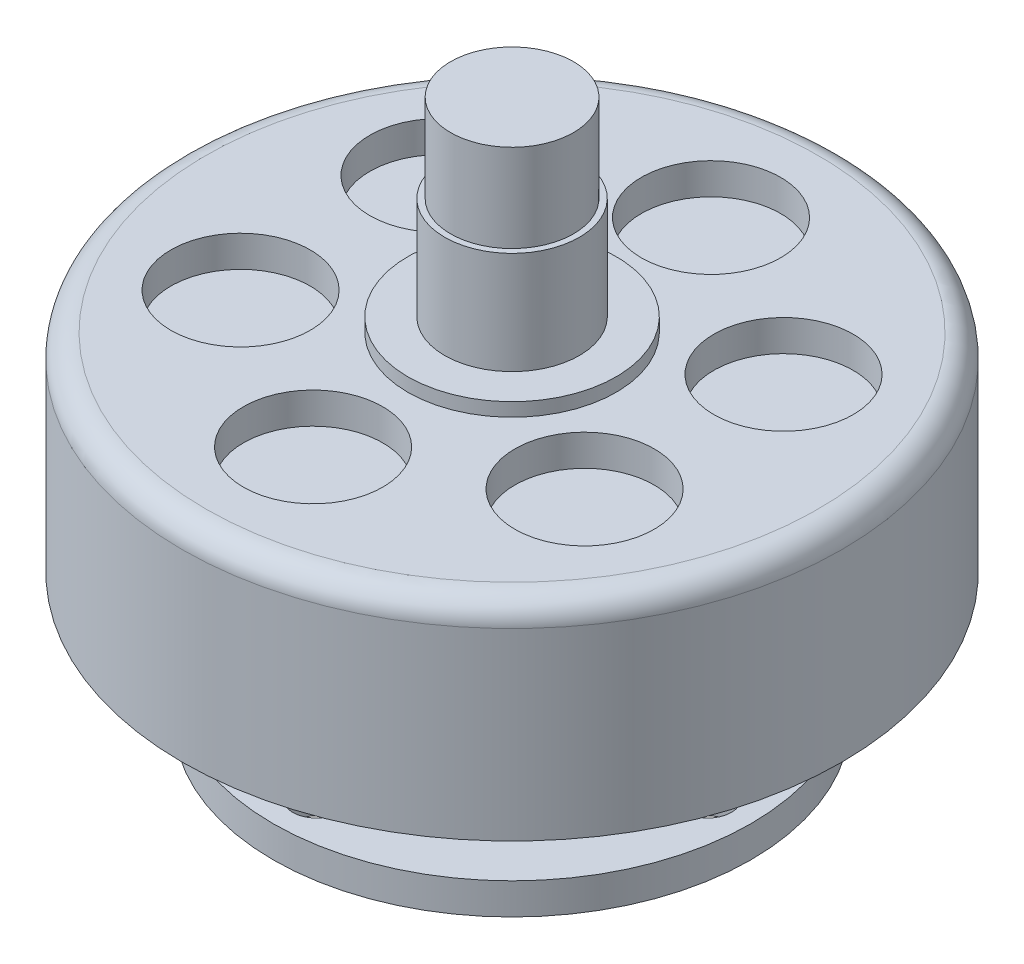
ISO-10303-21;
HEADER;
FILE_DESCRIPTION(('STEP AP214'),'2;1');
FILE_NAME('part.step','',(''),(''),'','','');
FILE_SCHEMA(('AUTOMOTIVE_DESIGN { 1 0 10303 214 1 1 1 1 }'));
ENDSEC;
DATA;
#1=APPLICATION_CONTEXT('core data for automotive mechanical design processes');
#2=APPLICATION_PROTOCOL_DEFINITION('international standard','automotive_design',2000,#1);
#3=PRODUCT_CONTEXT('',#1,'mechanical');
#4=PRODUCT('Part','Part','',(#3));
#5=PRODUCT_RELATED_PRODUCT_CATEGORY('part','',(#4));
#6=PRODUCT_DEFINITION_FORMATION('','',#4);
#7=PRODUCT_DEFINITION_CONTEXT('part definition',#1,'design');
#8=PRODUCT_DEFINITION('design','',#6,#7);
#9=PRODUCT_DEFINITION_SHAPE('','',#8);
#10=(LENGTH_UNIT() NAMED_UNIT(*) SI_UNIT(.MILLI.,.METRE.));
#11=(NAMED_UNIT(*) PLANE_ANGLE_UNIT() SI_UNIT($,.RADIAN.));
#12=(NAMED_UNIT(*) SI_UNIT($,.STERADIAN.) SOLID_ANGLE_UNIT());
#13=UNCERTAINTY_MEASURE_WITH_UNIT(LENGTH_MEASURE(1.E-05),#10,'distance_accuracy_value','');
#14=(GEOMETRIC_REPRESENTATION_CONTEXT(3) GLOBAL_UNCERTAINTY_ASSIGNED_CONTEXT((#13)) GLOBAL_UNIT_ASSIGNED_CONTEXT((#10,
#11,#12)) REPRESENTATION_CONTEXT('',''));
#15=CARTESIAN_POINT('',(0.,0.,0.));
#16=DIRECTION('',(0.,0.,1.));
#17=DIRECTION('',(1.,0.,0.));
#18=AXIS2_PLACEMENT_3D('',#15,#16,#17);
#19=CARTESIAN_POINT('',(0.,-9.5,0.));
#20=DIRECTION('',(0.,-1.,0.));
#21=DIRECTION('',(0.,0.,-1.));
#22=AXIS2_PLACEMENT_3D('',#19,#20,#21);
#23=PLANE('',#22);
#24=CARTESIAN_POINT('',(0.,-9.5,0.));
#25=DIRECTION('',(0.,-1.,0.));
#26=DIRECTION('',(0.,0.,-1.));
#27=AXIS2_PLACEMENT_3D('',#24,#25,#26);
#28=CIRCLE('',#27,3.);
#29=CARTESIAN_POINT('',(-1.75,-9.5,2.43669858620224));
#30=VERTEX_POINT('',#29);
#31=CARTESIAN_POINT('',(1.75,-9.5,2.43669858620224));
#32=VERTEX_POINT('',#31);
#33=EDGE_CURVE('E57',#30,#32,#28,.T.);
#34=ORIENTED_EDGE('',*,*,#33,.T.);
#35=DIRECTION('',(0.,0.,1.));
#36=VECTOR('',#35,1.);
#37=CARTESIAN_POINT('',(1.75,-9.5,3.45));
#38=LINE('',#37,#36);
#39=CARTESIAN_POINT('',(1.75,-9.5,0.968245836551854));
#40=VERTEX_POINT('',#39);
#41=EDGE_CURVE('E115',#40,#32,#38,.T.);
#42=ORIENTED_EDGE('',*,*,#41,.F.);
#43=CARTESIAN_POINT('',(0.,-9.5,0.));
#44=DIRECTION('',(0.,-1.,0.));
#45=DIRECTION('',(0.,0.,-1.));
#46=AXIS2_PLACEMENT_3D('',#43,#44,#45);
#47=CIRCLE('',#46,2.);
#48=CARTESIAN_POINT('',(-1.75,-9.5,0.968245836551854));
#49=VERTEX_POINT('',#48);
#50=EDGE_CURVE('E125',#49,#40,#47,.T.);
#51=ORIENTED_EDGE('',*,*,#50,.F.);
#52=DIRECTION('',(0.,0.,-1.));
#53=VECTOR('',#52,1.);
#54=CARTESIAN_POINT('',(-1.75,-9.5,0.0104918949249585));
#55=LINE('',#54,#53);
#56=EDGE_CURVE('E53',#30,#49,#55,.T.);
#57=ORIENTED_EDGE('',*,*,#56,.F.);
#58=EDGE_LOOP('',(#34,#42,#51,#57));
#59=FACE_BOUND('',#58,.T.);
#60=ADVANCED_FACE('F36',(#59),#23,.T.);
#61=CARTESIAN_POINT('',(0.,-11.,0.));
#62=DIRECTION('',(0.,1.,0.));
#63=DIRECTION('',(0.,0.,1.));
#64=AXIS2_PLACEMENT_3D('',#61,#62,#63);
#65=CYLINDRICAL_SURFACE('',#64,2.);
#66=CARTESIAN_POINT('',(0.,-11.,0.));
#67=DIRECTION('',(0.,-1.,0.));
#68=DIRECTION('',(0.,0.,-1.));
#69=AXIS2_PLACEMENT_3D('',#66,#67,#68);
#70=CIRCLE('',#69,2.);
#71=CARTESIAN_POINT('',(0.,-11.,-2.));
#72=VERTEX_POINT('',#71);
#73=EDGE_CURVE('E128',#72,#72,#70,.T.);
#74=ORIENTED_EDGE('',*,*,#73,.F.);
#75=EDGE_LOOP('',(#74));
#76=FACE_BOUND('',#75,.T.);
#77=DIRECTION('',(0.,1.,0.));
#78=VECTOR('',#77,1.);
#79=CARTESIAN_POINT('',(1.75,-11.,0.968245836551854));
#80=LINE('',#79,#78);
#81=CARTESIAN_POINT('',(1.75,-9.7,0.968245836551854));
#82=VERTEX_POINT('',#81);
#83=EDGE_CURVE('E11',#82,#40,#80,.T.);
#84=ORIENTED_EDGE('',*,*,#83,.F.);
#85=CARTESIAN_POINT('',(0.,-9.7,0.));
#86=DIRECTION('',(0.,1.,0.));
#87=DIRECTION('',(0.,0.,1.));
#88=AXIS2_PLACEMENT_3D('',#85,#86,#87);
#89=CIRCLE('',#88,2.);
#90=CARTESIAN_POINT('',(-1.75,-9.7,0.968245836551854));
#91=VERTEX_POINT('',#90);
#92=EDGE_CURVE('E91',#91,#82,#89,.T.);
#93=ORIENTED_EDGE('',*,*,#92,.F.);
#94=DIRECTION('',(0.,1.,0.));
#95=VECTOR('',#94,1.);
#96=CARTESIAN_POINT('',(-1.75,-11.,0.968245836551854));
#97=LINE('',#96,#95);
#98=EDGE_CURVE('E45',#49,#91,#97,.F.);
#99=ORIENTED_EDGE('',*,*,#98,.F.);
#100=ORIENTED_EDGE('',*,*,#50,.T.);
#101=EDGE_LOOP('',(#84,#93,#99,#100));
#102=FACE_BOUND('',#101,.T.);
#103=ADVANCED_FACE('F278',(#76,#102),#65,.T.);
#104=CARTESIAN_POINT('',(0.,13.25,0.));
#105=DIRECTION('',(0.,-1.,0.));
#106=DIRECTION('',(0.,0.,-1.));
#107=AXIS2_PLACEMENT_3D('',#104,#105,#106);
#108=CYLINDRICAL_SURFACE('',#107,21.05);
#109=CARTESIAN_POINT('',(0.,11.75,0.));
#110=DIRECTION('',(0.,1.,0.));
#111=DIRECTION('',(0.,0.,1.));
#112=AXIS2_PLACEMENT_3D('',#109,#110,#111);
#113=CIRCLE('',#112,21.05);
#114=CARTESIAN_POINT('',(0.,11.75,21.05));
#115=VERTEX_POINT('',#114);
#116=EDGE_CURVE('E209',#115,#115,#113,.F.);
#117=ORIENTED_EDGE('',*,*,#116,.T.);
#118=EDGE_LOOP('',(#117));
#119=FACE_BOUND('',#118,.T.);
#120=CARTESIAN_POINT('',(0.,0.,0.));
#121=DIRECTION('',(0.,1.,0.));
#122=DIRECTION('',(0.,0.,1.));
#123=AXIS2_PLACEMENT_3D('',#120,#121,#122);
#124=CIRCLE('',#123,21.05);
#125=CARTESIAN_POINT('',(0.,0.,21.05));
#126=VERTEX_POINT('',#125);
#127=EDGE_CURVE('E201',#126,#126,#124,.T.);
#128=ORIENTED_EDGE('',*,*,#127,.T.);
#129=EDGE_LOOP('',(#128));
#130=FACE_BOUND('',#129,.T.);
#131=ADVANCED_FACE('F248',(#119,#130),#108,.T.);
#132=CARTESIAN_POINT('',(0.,13.25,0.));
#133=DIRECTION('',(0.,1.,0.));
#134=DIRECTION('',(0.,0.,1.));
#135=AXIS2_PLACEMENT_3D('',#132,#133,#134);
#136=PLANE('',#135);
#137=CARTESIAN_POINT('',(0.,13.25,0.));
#138=DIRECTION('',(0.,1.,0.));
#139=DIRECTION('',(0.,0.,1.));
#140=AXIS2_PLACEMENT_3D('',#137,#138,#139);
#141=CIRCLE('',#140,6.65);
#142=CARTESIAN_POINT('',(0.,13.25,6.65));
#143=VERTEX_POINT('',#142);
#144=EDGE_CURVE('E229',#143,#143,#141,.T.);
#145=ORIENTED_EDGE('',*,*,#144,.F.);
#146=EDGE_LOOP('',(#145));
#147=FACE_BOUND('',#146,.T.);
#148=CARTESIAN_POINT('',(10.9964027158197,13.25,-6.33612373210293));
#149=DIRECTION('',(0.,1.,0.));
#150=DIRECTION('',(0.,0.,1.));
#151=AXIS2_PLACEMENT_3D('',#148,#149,#150);
#152=CIRCLE('',#151,4.45);
#153=CARTESIAN_POINT('',(10.9964027158197,13.25,-1.88612373210293));
#154=VERTEX_POINT('',#153);
#155=EDGE_CURVE('E172',#154,#154,#152,.T.);
#156=ORIENTED_EDGE('',*,*,#155,.F.);
#157=EDGE_LOOP('',(#156));
#158=FACE_BOUND('',#157,.T.);
#159=CARTESIAN_POINT('',(10.9854454714327,13.25,6.3551022360922));
#160=DIRECTION('',(0.,1.,0.));
#161=DIRECTION('',(0.,0.,1.));
#162=AXIS2_PLACEMENT_3D('',#159,#160,#161);
#163=CIRCLE('',#162,4.45);
#164=CARTESIAN_POINT('',(10.9854454714327,13.25,10.8051022360922));
#165=VERTEX_POINT('',#164);
#166=EDGE_CURVE('E178',#165,#165,#163,.T.);
#167=ORIENTED_EDGE('',*,*,#166,.F.);
#168=EDGE_LOOP('',(#167));
#169=FACE_BOUND('',#168,.T.);
#170=CARTESIAN_POINT('',(-0.0109572443865988,13.25,12.6912259681951));
#171=DIRECTION('',(0.,1.,0.));
#172=DIRECTION('',(0.,0.,1.));
#173=AXIS2_PLACEMENT_3D('',#170,#171,#172);
#174=CIRCLE('',#173,4.45);
#175=CARTESIAN_POINT('',(-0.0109572443865988,13.25,17.1412259681951));
#176=VERTEX_POINT('',#175);
#177=EDGE_CURVE('E184',#176,#176,#174,.T.);
#178=ORIENTED_EDGE('',*,*,#177,.F.);
#179=EDGE_LOOP('',(#178));
#180=FACE_BOUND('',#179,.T.);
#181=CARTESIAN_POINT('',(-10.9964027158188,13.25,6.33612373210293));
#182=DIRECTION('',(0.,1.,0.));
#183=DIRECTION('',(0.,0.,1.));
#184=AXIS2_PLACEMENT_3D('',#181,#182,#183);
#185=CIRCLE('',#184,4.45);
#186=CARTESIAN_POINT('',(-10.9964027158188,13.25,10.7861237321029));
#187=VERTEX_POINT('',#186);
#188=EDGE_CURVE('E190',#187,#187,#185,.T.);
#189=ORIENTED_EDGE('',*,*,#188,.F.);
#190=EDGE_LOOP('',(#189));
#191=FACE_BOUND('',#190,.T.);
#192=CARTESIAN_POINT('',(-10.9854454714318,13.25,-6.35510223609219));
#193=DIRECTION('',(0.,1.,0.));
#194=DIRECTION('',(0.,0.,1.));
#195=AXIS2_PLACEMENT_3D('',#192,#193,#194);
#196=CIRCLE('',#195,4.45);
#197=CARTESIAN_POINT('',(-10.9854454714318,13.25,-1.90510223609219));
#198=VERTEX_POINT('',#197);
#199=EDGE_CURVE('E167',#198,#198,#196,.T.);
#200=ORIENTED_EDGE('',*,*,#199,.F.);
#201=EDGE_LOOP('',(#200));
#202=FACE_BOUND('',#201,.T.);
#203=CARTESIAN_POINT('',(0.0109572443874472,13.25,-12.6912259681951));
#204=DIRECTION('',(0.,1.,0.));
#205=DIRECTION('',(0.,0.,1.));
#206=AXIS2_PLACEMENT_3D('',#203,#204,#205);
#207=CIRCLE('',#206,4.45);
#208=CARTESIAN_POINT('',(0.0109572443874472,13.25,-8.24122596819513));
#209=VERTEX_POINT('',#208);
#210=EDGE_CURVE('E171',#209,#209,#207,.T.);
#211=ORIENTED_EDGE('',*,*,#210,.F.);
#212=EDGE_LOOP('',(#211));
#213=FACE_BOUND('',#212,.T.);
#214=CARTESIAN_POINT('',(0.,13.25,0.));
#215=DIRECTION('',(0.,1.,0.));
#216=DIRECTION('',(0.,0.,1.));
#217=AXIS2_PLACEMENT_3D('',#214,#215,#216);
#218=CIRCLE('',#217,19.55);
#219=CARTESIAN_POINT('',(0.,13.25,19.55));
#220=VERTEX_POINT('',#219);
#221=EDGE_CURVE('E206',#220,#220,#218,.T.);
#222=ORIENTED_EDGE('',*,*,#221,.T.);
#223=EDGE_LOOP('',(#222));
#224=FACE_BOUND('',#223,.T.);
#225=ADVANCED_FACE('F244',(#147,#158,#169,#180,#191,#202,#213,#224),#136,.T.);
#226=CARTESIAN_POINT('',(0.,0.,0.));
#227=DIRECTION('',(0.,1.,0.));
#228=DIRECTION('',(0.,0.,1.));
#229=AXIS2_PLACEMENT_3D('',#226,#227,#228);
#230=PLANE('',#229);
#231=CARTESIAN_POINT('',(0.,0.,0.));
#232=DIRECTION('',(0.,1.,0.));
#233=DIRECTION('',(0.,0.,1.));
#234=AXIS2_PLACEMENT_3D('',#231,#232,#233);
#235=CIRCLE('',#234,5.90865219308832);
#236=CARTESIAN_POINT('',(0.,0.,5.90865219308832));
#237=VERTEX_POINT('',#236);
#238=EDGE_CURVE('E212',#237,#237,#235,.F.);
#239=ORIENTED_EDGE('',*,*,#238,.F.);
#240=EDGE_LOOP('',(#239));
#241=FACE_BOUND('',#240,.T.);
#242=ORIENTED_EDGE('',*,*,#127,.F.);
#243=EDGE_LOOP('',(#242));
#244=FACE_BOUND('',#243,.T.);
#245=ADVANCED_FACE('F247',(#241,#244),#230,.F.);
#246=CARTESIAN_POINT('',(0.,11.75,0.));
#247=DIRECTION('',(0.,1.,0.));
#248=DIRECTION('',(0.,0.,1.));
#249=AXIS2_PLACEMENT_3D('',#246,#247,#248);
#250=TOROIDAL_SURFACE('',#249,19.55,1.5);
#251=ORIENTED_EDGE('',*,*,#116,.F.);
#252=EDGE_LOOP('',(#251));
#253=FACE_BOUND('',#252,.T.);
#254=ORIENTED_EDGE('',*,*,#221,.F.);
#255=EDGE_LOOP('',(#254));
#256=FACE_BOUND('',#255,.T.);
#257=ADVANCED_FACE('F38',(#253,#256),#250,.T.);
#258=CARTESIAN_POINT('',(0.0109572443874472,11.25,-12.6912259681951));
#259=DIRECTION('',(0.,1.,0.));
#260=DIRECTION('',(0.,0.,1.));
#261=AXIS2_PLACEMENT_3D('',#258,#259,#260);
#262=CYLINDRICAL_SURFACE('',#261,4.45);
#263=CARTESIAN_POINT('',(0.0109572443874472,11.25,-12.6912259681951));
#264=DIRECTION('',(0.,1.,0.));
#265=DIRECTION('',(0.,0.,1.));
#266=AXIS2_PLACEMENT_3D('',#263,#264,#265);
#267=CIRCLE('',#266,4.45);
#268=CARTESIAN_POINT('',(0.0109572443874472,11.25,-8.24122596819513));
#269=VERTEX_POINT('',#268);
#270=EDGE_CURVE('E198',#269,#269,#267,.T.);
#271=ORIENTED_EDGE('',*,*,#270,.F.);
#272=EDGE_LOOP('',(#271));
#273=FACE_BOUND('',#272,.T.);
#274=ORIENTED_EDGE('',*,*,#210,.T.);
#275=EDGE_LOOP('',(#274));
#276=FACE_BOUND('',#275,.T.);
#277=ADVANCED_FACE('F265',(#273,#276),#262,.F.);
#278=CARTESIAN_POINT('',(0.0109572443874472,11.25,-12.6912259681951));
#279=DIRECTION('',(0.,1.,0.));
#280=DIRECTION('',(0.,0.,1.));
#281=AXIS2_PLACEMENT_3D('',#278,#279,#280);
#282=PLANE('',#281);
#283=ORIENTED_EDGE('',*,*,#270,.T.);
#284=EDGE_LOOP('',(#283));
#285=FACE_BOUND('',#284,.T.);
#286=ADVANCED_FACE('F271',(#285),#282,.T.);
#287=CARTESIAN_POINT('',(-10.9854454714318,11.25,-6.35510223609219));
#288=DIRECTION('',(0.,1.,0.));
#289=DIRECTION('',(0.,0.,1.));
#290=AXIS2_PLACEMENT_3D('',#287,#288,#289);
#291=CYLINDRICAL_SURFACE('',#290,4.45);
#292=CARTESIAN_POINT('',(-10.9854454714318,11.25,-6.35510223609219));
#293=DIRECTION('',(0.,1.,0.));
#294=DIRECTION('',(0.,0.,1.));
#295=AXIS2_PLACEMENT_3D('',#292,#293,#294);
#296=CIRCLE('',#295,4.45);
#297=CARTESIAN_POINT('',(-10.9854454714318,11.25,-1.90510223609219));
#298=VERTEX_POINT('',#297);
#299=EDGE_CURVE('E193',#298,#298,#296,.T.);
#300=ORIENTED_EDGE('',*,*,#299,.F.);
#301=EDGE_LOOP('',(#300));
#302=FACE_BOUND('',#301,.T.);
#303=ORIENTED_EDGE('',*,*,#199,.T.);
#304=EDGE_LOOP('',(#303));
#305=FACE_BOUND('',#304,.T.);
#306=ADVANCED_FACE('F371',(#302,#305),#291,.F.);
#307=CARTESIAN_POINT('',(-10.9854454714318,11.25,-6.35510223609219));
#308=DIRECTION('',(0.,1.,0.));
#309=DIRECTION('',(0.,0.,1.));
#310=AXIS2_PLACEMENT_3D('',#307,#308,#309);
#311=PLANE('',#310);
#312=ORIENTED_EDGE('',*,*,#299,.T.);
#313=EDGE_LOOP('',(#312));
#314=FACE_BOUND('',#313,.T.);
#315=ADVANCED_FACE('F367',(#314),#311,.T.);
#316=CARTESIAN_POINT('',(-10.9964027158188,11.25,6.33612373210293));
#317=DIRECTION('',(0.,1.,0.));
#318=DIRECTION('',(0.,0.,1.));
#319=AXIS2_PLACEMENT_3D('',#316,#317,#318);
#320=CYLINDRICAL_SURFACE('',#319,4.45);
#321=CARTESIAN_POINT('',(-10.9964027158188,11.25,6.33612373210293));
#322=DIRECTION('',(0.,1.,0.));
#323=DIRECTION('',(0.,0.,1.));
#324=AXIS2_PLACEMENT_3D('',#321,#322,#323);
#325=CIRCLE('',#324,4.45);
#326=CARTESIAN_POINT('',(-10.9964027158188,11.25,10.7861237321029));
#327=VERTEX_POINT('',#326);
#328=EDGE_CURVE('E187',#327,#327,#325,.T.);
#329=ORIENTED_EDGE('',*,*,#328,.F.);
#330=EDGE_LOOP('',(#329));
#331=FACE_BOUND('',#330,.T.);
#332=ORIENTED_EDGE('',*,*,#188,.T.);
#333=EDGE_LOOP('',(#332));
#334=FACE_BOUND('',#333,.T.);
#335=ADVANCED_FACE('F363',(#331,#334),#320,.F.);
#336=CARTESIAN_POINT('',(-10.9964027158188,11.25,6.33612373210293));
#337=DIRECTION('',(0.,1.,0.));
#338=DIRECTION('',(0.,0.,1.));
#339=AXIS2_PLACEMENT_3D('',#336,#337,#338);
#340=PLANE('',#339);
#341=ORIENTED_EDGE('',*,*,#328,.T.);
#342=EDGE_LOOP('',(#341));
#343=FACE_BOUND('',#342,.T.);
#344=ADVANCED_FACE('F359',(#343),#340,.T.);
#345=CARTESIAN_POINT('',(-0.0109572443865988,11.25,12.6912259681951));
#346=DIRECTION('',(0.,1.,0.));
#347=DIRECTION('',(0.,0.,1.));
#348=AXIS2_PLACEMENT_3D('',#345,#346,#347);
#349=CYLINDRICAL_SURFACE('',#348,4.45);
#350=CARTESIAN_POINT('',(-0.0109572443865988,11.25,12.6912259681951));
#351=DIRECTION('',(0.,1.,0.));
#352=DIRECTION('',(0.,0.,1.));
#353=AXIS2_PLACEMENT_3D('',#350,#351,#352);
#354=CIRCLE('',#353,4.45);
#355=CARTESIAN_POINT('',(-0.0109572443865988,11.25,17.1412259681951));
#356=VERTEX_POINT('',#355);
#357=EDGE_CURVE('E181',#356,#356,#354,.T.);
#358=ORIENTED_EDGE('',*,*,#357,.F.);
#359=EDGE_LOOP('',(#358));
#360=FACE_BOUND('',#359,.T.);
#361=ORIENTED_EDGE('',*,*,#177,.T.);
#362=EDGE_LOOP('',(#361));
#363=FACE_BOUND('',#362,.T.);
#364=ADVANCED_FACE('F355',(#360,#363),#349,.F.);
#365=CARTESIAN_POINT('',(-0.0109572443865988,11.25,12.6912259681951));
#366=DIRECTION('',(0.,1.,0.));
#367=DIRECTION('',(0.,0.,1.));
#368=AXIS2_PLACEMENT_3D('',#365,#366,#367);
#369=PLANE('',#368);
#370=ORIENTED_EDGE('',*,*,#357,.T.);
#371=EDGE_LOOP('',(#370));
#372=FACE_BOUND('',#371,.T.);
#373=ADVANCED_FACE('F351',(#372),#369,.T.);
#374=CARTESIAN_POINT('',(10.9854454714327,11.25,6.3551022360922));
#375=DIRECTION('',(0.,1.,0.));
#376=DIRECTION('',(0.,0.,1.));
#377=AXIS2_PLACEMENT_3D('',#374,#375,#376);
#378=CYLINDRICAL_SURFACE('',#377,4.45);
#379=CARTESIAN_POINT('',(10.9854454714327,11.25,6.3551022360922));
#380=DIRECTION('',(0.,1.,0.));
#381=DIRECTION('',(0.,0.,1.));
#382=AXIS2_PLACEMENT_3D('',#379,#380,#381);
#383=CIRCLE('',#382,4.45);
#384=CARTESIAN_POINT('',(10.9854454714327,11.25,10.8051022360922));
#385=VERTEX_POINT('',#384);
#386=EDGE_CURVE('E175',#385,#385,#383,.T.);
#387=ORIENTED_EDGE('',*,*,#386,.F.);
#388=EDGE_LOOP('',(#387));
#389=FACE_BOUND('',#388,.T.);
#390=ORIENTED_EDGE('',*,*,#166,.T.);
#391=EDGE_LOOP('',(#390));
#392=FACE_BOUND('',#391,.T.);
#393=ADVANCED_FACE('F347',(#389,#392),#378,.F.);
#394=CARTESIAN_POINT('',(10.9854454714327,11.25,6.3551022360922));
#395=DIRECTION('',(0.,1.,0.));
#396=DIRECTION('',(0.,0.,1.));
#397=AXIS2_PLACEMENT_3D('',#394,#395,#396);
#398=PLANE('',#397);
#399=ORIENTED_EDGE('',*,*,#386,.T.);
#400=EDGE_LOOP('',(#399));
#401=FACE_BOUND('',#400,.T.);
#402=ADVANCED_FACE('F343',(#401),#398,.T.);
#403=CARTESIAN_POINT('',(10.9964027158197,11.25,-6.33612373210293));
#404=DIRECTION('',(0.,1.,0.));
#405=DIRECTION('',(0.,0.,1.));
#406=AXIS2_PLACEMENT_3D('',#403,#404,#405);
#407=CYLINDRICAL_SURFACE('',#406,4.45);
#408=CARTESIAN_POINT('',(10.9964027158197,11.25,-6.33612373210293));
#409=DIRECTION('',(0.,1.,0.));
#410=DIRECTION('',(0.,0.,1.));
#411=AXIS2_PLACEMENT_3D('',#408,#409,#410);
#412=CIRCLE('',#411,4.45);
#413=CARTESIAN_POINT('',(10.9964027158197,11.25,-1.88612373210293));
#414=VERTEX_POINT('',#413);
#415=EDGE_CURVE('E168',#414,#414,#412,.T.);
#416=ORIENTED_EDGE('',*,*,#415,.F.);
#417=EDGE_LOOP('',(#416));
#418=FACE_BOUND('',#417,.T.);
#419=ORIENTED_EDGE('',*,*,#155,.T.);
#420=EDGE_LOOP('',(#419));
#421=FACE_BOUND('',#420,.T.);
#422=ADVANCED_FACE('F339',(#418,#421),#407,.F.);
#423=CARTESIAN_POINT('',(10.9964027158197,11.25,-6.33612373210293));
#424=DIRECTION('',(0.,1.,0.));
#425=DIRECTION('',(0.,0.,1.));
#426=AXIS2_PLACEMENT_3D('',#423,#424,#425);
#427=PLANE('',#426);
#428=ORIENTED_EDGE('',*,*,#415,.T.);
#429=EDGE_LOOP('',(#428));
#430=FACE_BOUND('',#429,.T.);
#431=ADVANCED_FACE('F327',(#430),#427,.T.);
#432=CARTESIAN_POINT('',(0.,-6.3,0.));
#433=DIRECTION('',(0.,1.,0.));
#434=DIRECTION('',(0.,0.,1.));
#435=AXIS2_PLACEMENT_3D('',#432,#433,#434);
#436=CYLINDRICAL_SURFACE('',#435,5.90865219308832);
#437=CARTESIAN_POINT('',(0.,-6.3,0.));
#438=DIRECTION('',(0.,-1.,0.));
#439=DIRECTION('',(0.,0.,-1.));
#440=AXIS2_PLACEMENT_3D('',#437,#438,#439);
#441=CIRCLE('',#440,5.90865219308832);
#442=CARTESIAN_POINT('',(0.,-6.3,-5.90865219308832));
#443=VERTEX_POINT('',#442);
#444=EDGE_CURVE('E159',#443,#443,#441,.T.);
#445=ORIENTED_EDGE('',*,*,#444,.F.);
#446=EDGE_LOOP('',(#445));
#447=FACE_BOUND('',#446,.T.);
#448=ORIENTED_EDGE('',*,*,#238,.T.);
#449=EDGE_LOOP('',(#448));
#450=FACE_BOUND('',#449,.T.);
#451=ADVANCED_FACE('F317',(#447,#450),#436,.T.);
#452=CARTESIAN_POINT('',(0.,-8.3,0.));
#453=DIRECTION('',(0.,-1.,0.));
#454=DIRECTION('',(0.,0.,-1.));
#455=AXIS2_PLACEMENT_3D('',#452,#453,#454);
#456=PLANE('',#455);
#457=CARTESIAN_POINT('',(0.,-8.3,0.));
#458=DIRECTION('',(0.,-1.,0.));
#459=DIRECTION('',(0.,0.,-1.));
#460=AXIS2_PLACEMENT_3D('',#457,#458,#459);
#461=CIRCLE('',#460,3.);
#462=CARTESIAN_POINT('',(0.,-8.3,-3.));
#463=VERTEX_POINT('',#462);
#464=EDGE_CURVE('E103',#463,#463,#461,.T.);
#465=ORIENTED_EDGE('',*,*,#464,.F.);
#466=EDGE_LOOP('',(#465));
#467=FACE_BOUND('',#466,.T.);
#468=CARTESIAN_POINT('',(3.53740559381116E-13,-8.3,-12.5));
#469=DIRECTION('',(0.,-1.,0.));
#470=DIRECTION('',(0.,0.,-1.));
#471=AXIS2_PLACEMENT_3D('',#468,#469,#470);
#472=CIRCLE('',#471,1.5);
#473=CARTESIAN_POINT('',(3.53740559381116E-13,-8.3,-14.));
#474=VERTEX_POINT('',#473);
#475=EDGE_CURVE('E138',#474,#474,#472,.T.);
#476=ORIENTED_EDGE('',*,*,#475,.F.);
#477=EDGE_LOOP('',(#476));
#478=FACE_BOUND('',#477,.T.);
#479=CARTESIAN_POINT('',(-3.53740559381116E-13,-8.3,12.5));
#480=DIRECTION('',(0.,-1.,0.));
#481=DIRECTION('',(0.,0.,-1.));
#482=AXIS2_PLACEMENT_3D('',#479,#480,#481);
#483=CIRCLE('',#482,1.5);
#484=CARTESIAN_POINT('',(-3.53740559381116E-13,-8.3,11.));
#485=VERTEX_POINT('',#484);
#486=EDGE_CURVE('E150',#485,#485,#483,.T.);
#487=ORIENTED_EDGE('',*,*,#486,.F.);
#488=EDGE_LOOP('',(#487));
#489=FACE_BOUND('',#488,.T.);
#490=CARTESIAN_POINT('',(0.,-8.3,0.));
#491=DIRECTION('',(0.,-1.,0.));
#492=DIRECTION('',(0.,0.,-1.));
#493=AXIS2_PLACEMENT_3D('',#490,#491,#492);
#494=CIRCLE('',#493,15.25);
#495=CARTESIAN_POINT('',(0.,-8.3,-15.25));
#496=VERTEX_POINT('',#495);
#497=EDGE_CURVE('E156',#496,#496,#494,.T.);
#498=ORIENTED_EDGE('',*,*,#497,.T.);
#499=EDGE_LOOP('',(#498));
#500=FACE_BOUND('',#499,.T.);
#501=CARTESIAN_POINT('',(12.5,-8.3,3.54505963630583E-13));
#502=DIRECTION('',(0.,-1.,0.));
#503=DIRECTION('',(0.,0.,-1.));
#504=AXIS2_PLACEMENT_3D('',#501,#502,#503);
#505=CIRCLE('',#504,1.5);
#506=CARTESIAN_POINT('',(12.5,-8.3,-1.49999999999965));
#507=VERTEX_POINT('',#506);
#508=EDGE_CURVE('E144',#507,#507,#505,.T.);
#509=ORIENTED_EDGE('',*,*,#508,.F.);
#510=EDGE_LOOP('',(#509));
#511=FACE_BOUND('',#510,.T.);
#512=CARTESIAN_POINT('',(-12.5,-8.3,-3.56036772129517E-13));
#513=DIRECTION('',(0.,-1.,0.));
#514=DIRECTION('',(0.,0.,-1.));
#515=AXIS2_PLACEMENT_3D('',#512,#513,#514);
#516=CIRCLE('',#515,1.5);
#517=CARTESIAN_POINT('',(-12.5,-8.3,-1.50000000000036));
#518=VERTEX_POINT('',#517);
#519=EDGE_CURVE('E132',#518,#518,#516,.T.);
#520=ORIENTED_EDGE('',*,*,#519,.F.);
#521=EDGE_LOOP('',(#520));
#522=FACE_BOUND('',#521,.T.);
#523=ADVANCED_FACE('F313',(#467,#478,#489,#500,#511,#522),#456,.T.);
#524=CARTESIAN_POINT('',(0.,-6.3,0.));
#525=DIRECTION('',(0.,-1.,0.));
#526=DIRECTION('',(0.,0.,-1.));
#527=AXIS2_PLACEMENT_3D('',#524,#525,#526);
#528=PLANE('',#527);
#529=ORIENTED_EDGE('',*,*,#444,.T.);
#530=EDGE_LOOP('',(#529));
#531=FACE_BOUND('',#530,.T.);
#532=CARTESIAN_POINT('',(0.,-6.3,0.));
#533=DIRECTION('',(0.,-1.,0.));
#534=DIRECTION('',(0.,0.,-1.));
#535=AXIS2_PLACEMENT_3D('',#532,#533,#534);
#536=CIRCLE('',#535,15.25);
#537=CARTESIAN_POINT('',(0.,-6.3,-15.25));
#538=VERTEX_POINT('',#537);
#539=EDGE_CURVE('E153',#538,#538,#536,.T.);
#540=ORIENTED_EDGE('',*,*,#539,.F.);
#541=EDGE_LOOP('',(#540));
#542=FACE_BOUND('',#541,.T.);
#543=CARTESIAN_POINT('',(-3.53740559381116E-13,-6.3,12.5));
#544=DIRECTION('',(0.,-1.,0.));
#545=DIRECTION('',(0.,0.,-1.));
#546=AXIS2_PLACEMENT_3D('',#543,#544,#545);
#547=CIRCLE('',#546,1.5);
#548=CARTESIAN_POINT('',(-3.53740559381116E-13,-6.3,11.));
#549=VERTEX_POINT('',#548);
#550=EDGE_CURVE('E147',#549,#549,#547,.T.);
#551=ORIENTED_EDGE('',*,*,#550,.T.);
#552=EDGE_LOOP('',(#551));
#553=FACE_BOUND('',#552,.T.);
#554=CARTESIAN_POINT('',(12.5,-6.3,3.54505963630583E-13));
#555=DIRECTION('',(0.,-1.,0.));
#556=DIRECTION('',(0.,0.,-1.));
#557=AXIS2_PLACEMENT_3D('',#554,#555,#556);
#558=CIRCLE('',#557,1.5);
#559=CARTESIAN_POINT('',(12.5,-6.3,-1.49999999999965));
#560=VERTEX_POINT('',#559);
#561=EDGE_CURVE('E141',#560,#560,#558,.T.);
#562=ORIENTED_EDGE('',*,*,#561,.T.);
#563=EDGE_LOOP('',(#562));
#564=FACE_BOUND('',#563,.T.);
#565=CARTESIAN_POINT('',(3.53740559381116E-13,-6.3,-12.5));
#566=DIRECTION('',(0.,-1.,0.));
#567=DIRECTION('',(0.,0.,-1.));
#568=AXIS2_PLACEMENT_3D('',#565,#566,#567);
#569=CIRCLE('',#568,1.5);
#570=CARTESIAN_POINT('',(3.53740559381116E-13,-6.3,-14.));
#571=VERTEX_POINT('',#570);
#572=EDGE_CURVE('E135',#571,#571,#569,.T.);
#573=ORIENTED_EDGE('',*,*,#572,.T.);
#574=EDGE_LOOP('',(#573));
#575=FACE_BOUND('',#574,.T.);
#576=CARTESIAN_POINT('',(-12.5,-6.3,-3.56036772129517E-13));
#577=DIRECTION('',(0.,-1.,0.));
#578=DIRECTION('',(0.,0.,-1.));
#579=AXIS2_PLACEMENT_3D('',#576,#577,#578);
#580=CIRCLE('',#579,1.5);
#581=CARTESIAN_POINT('',(-12.5,-6.3,-1.50000000000036));
#582=VERTEX_POINT('',#581);
#583=EDGE_CURVE('E131',#582,#582,#580,.T.);
#584=ORIENTED_EDGE('',*,*,#583,.T.);
#585=EDGE_LOOP('',(#584));
#586=FACE_BOUND('',#585,.T.);
#587=ADVANCED_FACE('F316',(#531,#542,#553,#564,#575,#586),#528,.F.);
#588=CARTESIAN_POINT('',(0.,-8.3,0.));
#589=DIRECTION('',(0.,1.,0.));
#590=DIRECTION('',(0.,0.,1.));
#591=AXIS2_PLACEMENT_3D('',#588,#589,#590);
#592=CYLINDRICAL_SURFACE('',#591,15.25);
#593=ORIENTED_EDGE('',*,*,#497,.F.);
#594=EDGE_LOOP('',(#593));
#595=FACE_BOUND('',#594,.T.);
#596=ORIENTED_EDGE('',*,*,#539,.T.);
#597=EDGE_LOOP('',(#596));
#598=FACE_BOUND('',#597,.T.);
#599=ADVANCED_FACE('F311',(#595,#598),#592,.T.);
#600=CARTESIAN_POINT('',(-3.53740559381116E-13,-8.3,12.5));
#601=DIRECTION('',(0.,1.,0.));
#602=DIRECTION('',(0.,0.,1.));
#603=AXIS2_PLACEMENT_3D('',#600,#601,#602);
#604=CYLINDRICAL_SURFACE('',#603,1.5);
#605=ORIENTED_EDGE('',*,*,#486,.T.);
#606=EDGE_LOOP('',(#605));
#607=FACE_BOUND('',#606,.T.);
#608=ORIENTED_EDGE('',*,*,#550,.F.);
#609=EDGE_LOOP('',(#608));
#610=FACE_BOUND('',#609,.T.);
#611=ADVANCED_FACE('F307',(#607,#610),#604,.F.);
#612=CARTESIAN_POINT('',(12.5,-8.3,3.54505963630583E-13));
#613=DIRECTION('',(0.,1.,0.));
#614=DIRECTION('',(0.,0.,1.));
#615=AXIS2_PLACEMENT_3D('',#612,#613,#614);
#616=CYLINDRICAL_SURFACE('',#615,1.5);
#617=ORIENTED_EDGE('',*,*,#508,.T.);
#618=EDGE_LOOP('',(#617));
#619=FACE_BOUND('',#618,.T.);
#620=ORIENTED_EDGE('',*,*,#561,.F.);
#621=EDGE_LOOP('',(#620));
#622=FACE_BOUND('',#621,.T.);
#623=ADVANCED_FACE('F303',(#619,#622),#616,.F.);
#624=CARTESIAN_POINT('',(3.53740559381116E-13,-8.3,-12.5));
#625=DIRECTION('',(0.,1.,0.));
#626=DIRECTION('',(0.,0.,1.));
#627=AXIS2_PLACEMENT_3D('',#624,#625,#626);
#628=CYLINDRICAL_SURFACE('',#627,1.5);
#629=ORIENTED_EDGE('',*,*,#475,.T.);
#630=EDGE_LOOP('',(#629));
#631=FACE_BOUND('',#630,.T.);
#632=ORIENTED_EDGE('',*,*,#572,.F.);
#633=EDGE_LOOP('',(#632));
#634=FACE_BOUND('',#633,.T.);
#635=ADVANCED_FACE('F299',(#631,#634),#628,.F.);
#636=CARTESIAN_POINT('',(-12.5,-8.3,-3.56036772129517E-13));
#637=DIRECTION('',(0.,1.,0.));
#638=DIRECTION('',(0.,0.,1.));
#639=AXIS2_PLACEMENT_3D('',#636,#637,#638);
#640=CYLINDRICAL_SURFACE('',#639,1.5);
#641=ORIENTED_EDGE('',*,*,#519,.T.);
#642=EDGE_LOOP('',(#641));
#643=FACE_BOUND('',#642,.T.);
#644=ORIENTED_EDGE('',*,*,#583,.F.);
#645=EDGE_LOOP('',(#644));
#646=FACE_BOUND('',#645,.T.);
#647=ADVANCED_FACE('F292',(#643,#646),#640,.F.);
#648=CARTESIAN_POINT('',(0.,-9.5,0.));
#649=DIRECTION('',(0.,1.,0.));
#650=DIRECTION('',(0.,0.,1.));
#651=AXIS2_PLACEMENT_3D('',#648,#649,#650);
#652=CYLINDRICAL_SURFACE('',#651,3.);
#653=EDGE_CURVE('E122',#32,#30,#28,.T.);
#654=ORIENTED_EDGE('',*,*,#653,.F.);
#655=ORIENTED_EDGE('',*,*,#33,.F.);
#656=EDGE_LOOP('',(#654,#655));
#657=FACE_BOUND('',#656,.T.);
#658=ORIENTED_EDGE('',*,*,#464,.T.);
#659=EDGE_LOOP('',(#658));
#660=FACE_BOUND('',#659,.T.);
#661=ADVANCED_FACE('F288',(#657,#660),#652,.T.);
#662=CARTESIAN_POINT('',(0.,-11.,0.));
#663=DIRECTION('',(0.,-1.,0.));
#664=DIRECTION('',(0.,0.,-1.));
#665=AXIS2_PLACEMENT_3D('',#662,#663,#664);
#666=PLANE('',#665);
#667=ORIENTED_EDGE('',*,*,#73,.T.);
#668=EDGE_LOOP('',(#667));
#669=FACE_BOUND('',#668,.T.);
#670=ADVANCED_FACE('F291',(#669),#666,.T.);
#671=CARTESIAN_POINT('',(1.75,-9.7,3.45));
#672=DIRECTION('',(-1.,0.,0.));
#673=DIRECTION('',(0.,0.,1.));
#674=AXIS2_PLACEMENT_3D('',#671,#672,#673);
#675=PLANE('',#674);
#676=DIRECTION('',(0.,0.,1.));
#677=VECTOR('',#676,1.);
#678=CARTESIAN_POINT('',(1.75,-9.7,3.45));
#679=LINE('',#678,#677);
#680=CARTESIAN_POINT('',(1.75,-9.7,3.45));
#681=VERTEX_POINT('',#680);
#682=EDGE_CURVE('E84',#82,#681,#679,.T.);
#683=ORIENTED_EDGE('',*,*,#682,.F.);
#684=ORIENTED_EDGE('',*,*,#83,.T.);
#685=ORIENTED_EDGE('',*,*,#41,.T.);
#686=CARTESIAN_POINT('',(1.75,-9.5,3.45));
#687=VERTEX_POINT('',#686);
#688=EDGE_CURVE('E100',#32,#687,#38,.T.);
#689=ORIENTED_EDGE('',*,*,#688,.T.);
#690=DIRECTION('',(0.,1.,0.));
#691=VECTOR('',#690,1.);
#692=CARTESIAN_POINT('',(1.75,-9.7,3.45));
#693=LINE('',#692,#691);
#694=EDGE_CURVE('E96',#681,#687,#693,.T.);
#695=ORIENTED_EDGE('',*,*,#694,.F.);
#696=EDGE_LOOP('',(#683,#684,#685,#689,#695));
#697=FACE_BOUND('',#696,.T.);
#698=ADVANCED_FACE('F97',(#697),#675,.F.);
#699=CARTESIAN_POINT('',(-1.75,-9.7,0.0104918949249585));
#700=DIRECTION('',(1.,0.,0.));
#701=DIRECTION('',(0.,0.,-1.));
#702=AXIS2_PLACEMENT_3D('',#699,#700,#701);
#703=PLANE('',#702);
#704=ORIENTED_EDGE('',*,*,#56,.T.);
#705=ORIENTED_EDGE('',*,*,#98,.T.);
#706=DIRECTION('',(0.,0.,-1.));
#707=VECTOR('',#706,1.);
#708=CARTESIAN_POINT('',(-1.75,-9.7,0.0104918949249585));
#709=LINE('',#708,#707);
#710=CARTESIAN_POINT('',(-1.75,-9.7,3.45));
#711=VERTEX_POINT('',#710);
#712=EDGE_CURVE('E109',#711,#91,#709,.T.);
#713=ORIENTED_EDGE('',*,*,#712,.F.);
#714=DIRECTION('',(0.,1.,0.));
#715=VECTOR('',#714,1.);
#716=CARTESIAN_POINT('',(-1.75,-9.7,3.45));
#717=LINE('',#716,#715);
#718=CARTESIAN_POINT('',(-1.75,-9.5,3.45));
#719=VERTEX_POINT('',#718);
#720=EDGE_CURVE('E104',#711,#719,#717,.T.);
#721=ORIENTED_EDGE('',*,*,#720,.T.);
#722=EDGE_CURVE('E93',#719,#30,#55,.T.);
#723=ORIENTED_EDGE('',*,*,#722,.T.);
#724=EDGE_LOOP('',(#704,#705,#713,#721,#723));
#725=FACE_BOUND('',#724,.T.);
#726=ADVANCED_FACE('F553',(#725),#703,.F.);
#727=CARTESIAN_POINT('',(-1.75,-9.7,3.45));
#728=DIRECTION('',(0.,0.,-1.));
#729=DIRECTION('',(-1.,0.,0.));
#730=AXIS2_PLACEMENT_3D('',#727,#728,#729);
#731=PLANE('',#730);
#732=DIRECTION('',(-1.,0.,0.));
#733=VECTOR('',#732,1.);
#734=CARTESIAN_POINT('',(-1.75,-9.5,3.45));
#735=LINE('',#734,#733);
#736=EDGE_CURVE('E117',#687,#719,#735,.T.);
#737=ORIENTED_EDGE('',*,*,#736,.T.);
#738=ORIENTED_EDGE('',*,*,#720,.F.);
#739=DIRECTION('',(-1.,0.,0.));
#740=VECTOR('',#739,1.);
#741=CARTESIAN_POINT('',(-1.75,-9.7,3.45));
#742=LINE('',#741,#740);
#743=EDGE_CURVE('E89',#681,#711,#742,.T.);
#744=ORIENTED_EDGE('',*,*,#743,.F.);
#745=ORIENTED_EDGE('',*,*,#694,.T.);
#746=EDGE_LOOP('',(#737,#738,#744,#745));
#747=FACE_BOUND('',#746,.T.);
#748=ADVANCED_FACE('F106',(#747),#731,.F.);
#749=CARTESIAN_POINT('',(0.,-9.7,0.));
#750=DIRECTION('',(0.,1.,0.));
#751=DIRECTION('',(0.,0.,1.));
#752=AXIS2_PLACEMENT_3D('',#749,#750,#751);
#753=PLANE('',#752);
#754=ORIENTED_EDGE('',*,*,#712,.T.);
#755=ORIENTED_EDGE('',*,*,#92,.T.);
#756=ORIENTED_EDGE('',*,*,#682,.T.);
#757=ORIENTED_EDGE('',*,*,#743,.T.);
#758=EDGE_LOOP('',(#754,#755,#756,#757));
#759=FACE_BOUND('',#758,.T.);
#760=ADVANCED_FACE('F87',(#759),#753,.F.);
#761=CARTESIAN_POINT('',(0.,-9.5,0.));
#762=DIRECTION('',(0.,1.,0.));
#763=DIRECTION('',(0.,0.,1.));
#764=AXIS2_PLACEMENT_3D('',#761,#762,#763);
#765=PLANE('',#764);
#766=ORIENTED_EDGE('',*,*,#653,.T.);
#767=ORIENTED_EDGE('',*,*,#722,.F.);
#768=ORIENTED_EDGE('',*,*,#736,.F.);
#769=ORIENTED_EDGE('',*,*,#688,.F.);
#770=EDGE_LOOP('',(#766,#767,#768,#769));
#771=FACE_BOUND('',#770,.T.);
#772=ADVANCED_FACE('F240',(#771),#765,.T.);
#773=CARTESIAN_POINT('',(0.,14.11,0.));
#774=DIRECTION('',(0.,-1.,0.));
#775=DIRECTION('',(0.,0.,-1.));
#776=AXIS2_PLACEMENT_3D('',#773,#774,#775);
#777=CYLINDRICAL_SURFACE('',#776,6.65);
#778=CARTESIAN_POINT('',(0.,14.11,0.));
#779=DIRECTION('',(0.,1.,0.));
#780=DIRECTION('',(0.,0.,1.));
#781=AXIS2_PLACEMENT_3D('',#778,#779,#780);
#782=CIRCLE('',#781,6.65);
#783=CARTESIAN_POINT('',(0.,14.11,6.65));
#784=VERTEX_POINT('',#783);
#785=EDGE_CURVE('E227',#784,#784,#782,.T.);
#786=ORIENTED_EDGE('',*,*,#785,.F.);
#787=EDGE_LOOP('',(#786));
#788=FACE_BOUND('',#787,.T.);
#789=ORIENTED_EDGE('',*,*,#144,.T.);
#790=EDGE_LOOP('',(#789));
#791=FACE_BOUND('',#790,.T.);
#792=ADVANCED_FACE('F237',(#788,#791),#777,.T.);
#793=CARTESIAN_POINT('',(0.,14.11,0.));
#794=DIRECTION('',(0.,1.,0.));
#795=DIRECTION('',(0.,0.,1.));
#796=AXIS2_PLACEMENT_3D('',#793,#794,#795);
#797=PLANE('',#796);
#798=CARTESIAN_POINT('',(0.,14.11,0.));
#799=DIRECTION('',(0.,1.,0.));
#800=DIRECTION('',(0.,0.,1.));
#801=AXIS2_PLACEMENT_3D('',#798,#799,#800);
#802=CIRCLE('',#801,4.3);
#803=CARTESIAN_POINT('',(0.,14.11,4.3));
#804=VERTEX_POINT('',#803);
#805=EDGE_CURVE('E40',#804,#804,#802,.T.);
#806=ORIENTED_EDGE('',*,*,#805,.F.);
#807=EDGE_LOOP('',(#806));
#808=FACE_BOUND('',#807,.T.);
#809=ORIENTED_EDGE('',*,*,#785,.T.);
#810=EDGE_LOOP('',(#809));
#811=FACE_BOUND('',#810,.T.);
#812=ADVANCED_FACE('F235',(#808,#811),#797,.T.);
#813=CARTESIAN_POINT('',(0.,26.25,0.));
#814=DIRECTION('',(0.,1.,0.));
#815=DIRECTION('',(0.,0.,1.));
#816=AXIS2_PLACEMENT_3D('',#813,#814,#815);
#817=PLANE('',#816);
#818=CARTESIAN_POINT('',(0.,26.25,0.));
#819=DIRECTION('',(0.,1.,0.));
#820=DIRECTION('',(0.,0.,1.));
#821=AXIS2_PLACEMENT_3D('',#818,#819,#820);
#822=CIRCLE('',#821,3.925);
#823=CARTESIAN_POINT('',(0.,26.25,-3.925));
#824=VERTEX_POINT('',#823);
#825=EDGE_CURVE('E164',#824,#824,#822,.T.);
#826=ORIENTED_EDGE('',*,*,#825,.T.);
#827=EDGE_LOOP('',(#826));
#828=FACE_BOUND('',#827,.T.);
#829=ADVANCED_FACE('F329',(#828),#817,.T.);
#830=CARTESIAN_POINT('',(0.,26.25,0.));
#831=DIRECTION('',(0.,-1.,0.));
#832=DIRECTION('',(0.,0.,-1.));
#833=AXIS2_PLACEMENT_3D('',#830,#831,#832);
#834=CYLINDRICAL_SURFACE('',#833,3.925);
#835=CARTESIAN_POINT('',(0.,20.65,0.));
#836=DIRECTION('',(0.,1.,0.));
#837=DIRECTION('',(0.,0.,1.));
#838=AXIS2_PLACEMENT_3D('',#835,#836,#837);
#839=CIRCLE('',#838,3.925);
#840=CARTESIAN_POINT('',(0.,20.65,-3.925));
#841=VERTEX_POINT('',#840);
#842=EDGE_CURVE('E116',#841,#841,#839,.T.);
#843=CARTESIAN_POINT('',(0.,20.65,-3.925));
#844=CARTESIAN_POINT('',(0.,20.7083333333333,-3.925));
#845=CARTESIAN_POINT('',(0.,20.7666666666667,-3.925));
#846=CARTESIAN_POINT('',(0.,20.8833333333333,-3.925));
#847=CARTESIAN_POINT('',(0.,20.9416666666667,-3.925));
#848=CARTESIAN_POINT('',(0.,21.0583333333333,-3.925));
#849=CARTESIAN_POINT('',(0.,21.1166666666667,-3.925));
#850=CARTESIAN_POINT('',(0.,21.2333333333333,-3.925));
#851=CARTESIAN_POINT('',(0.,21.2916666666667,-3.925));
#852=CARTESIAN_POINT('',(0.,21.4083333333333,-3.925));
#853=CARTESIAN_POINT('',(0.,21.4666666666667,-3.925));
#854=CARTESIAN_POINT('',(0.,21.5833333333333,-3.925));
#855=CARTESIAN_POINT('',(0.,21.6416666666667,-3.925));
#856=CARTESIAN_POINT('',(0.,21.7583333333333,-3.925));
#857=CARTESIAN_POINT('',(0.,21.8166666666667,-3.925));
#858=CARTESIAN_POINT('',(0.,21.9333333333333,-3.925));
#859=CARTESIAN_POINT('',(0.,21.9916666666667,-3.925));
#860=CARTESIAN_POINT('',(0.,22.1083333333333,-3.925));
#861=CARTESIAN_POINT('',(0.,22.1666666666667,-3.925));
#862=CARTESIAN_POINT('',(0.,22.2833333333333,-3.925));
#863=CARTESIAN_POINT('',(0.,22.3416666666667,-3.925));
#864=CARTESIAN_POINT('',(0.,22.4583333333333,-3.925));
#865=CARTESIAN_POINT('',(0.,22.5166666666667,-3.925));
#866=CARTESIAN_POINT('',(0.,22.6333333333333,-3.925));
#867=CARTESIAN_POINT('',(0.,22.6916666666667,-3.925));
#868=CARTESIAN_POINT('',(0.,22.8083333333333,-3.925));
#869=CARTESIAN_POINT('',(0.,22.8666666666667,-3.925));
#870=CARTESIAN_POINT('',(0.,22.9833333333333,-3.925));
#871=CARTESIAN_POINT('',(0.,23.0416666666667,-3.925));
#872=CARTESIAN_POINT('',(0.,23.1583333333333,-3.925));
#873=CARTESIAN_POINT('',(0.,23.2166666666667,-3.925));
#874=CARTESIAN_POINT('',(0.,23.3333333333333,-3.925));
#875=CARTESIAN_POINT('',(0.,23.3916666666667,-3.925));
#876=CARTESIAN_POINT('',(0.,23.5083333333333,-3.925));
#877=CARTESIAN_POINT('',(0.,23.5666666666667,-3.925));
#878=CARTESIAN_POINT('',(0.,23.6833333333333,-3.925));
#879=CARTESIAN_POINT('',(0.,23.7416666666667,-3.925));
#880=CARTESIAN_POINT('',(0.,23.8583333333333,-3.925));
#881=CARTESIAN_POINT('',(0.,23.9166666666667,-3.925));
#882=CARTESIAN_POINT('',(0.,24.0333333333333,-3.925));
#883=CARTESIAN_POINT('',(0.,24.0916666666667,-3.925));
#884=CARTESIAN_POINT('',(0.,24.2083333333333,-3.925));
#885=CARTESIAN_POINT('',(0.,24.2666666666667,-3.925));
#886=CARTESIAN_POINT('',(0.,24.3833333333333,-3.925));
#887=CARTESIAN_POINT('',(0.,24.4416666666667,-3.925));
#888=CARTESIAN_POINT('',(0.,24.5583333333333,-3.925));
#889=CARTESIAN_POINT('',(0.,24.6166666666667,-3.925));
#890=CARTESIAN_POINT('',(0.,24.7333333333333,-3.925));
#891=CARTESIAN_POINT('',(0.,24.7916666666667,-3.925));
#892=CARTESIAN_POINT('',(0.,24.9083333333333,-3.925));
#893=CARTESIAN_POINT('',(0.,24.9666666666667,-3.925));
#894=CARTESIAN_POINT('',(0.,25.0833333333333,-3.925));
#895=CARTESIAN_POINT('',(0.,25.1416666666667,-3.925));
#896=CARTESIAN_POINT('',(0.,25.2583333333333,-3.925));
#897=CARTESIAN_POINT('',(0.,25.3166666666667,-3.925));
#898=CARTESIAN_POINT('',(0.,25.4333333333333,-3.925));
#899=CARTESIAN_POINT('',(0.,25.4916666666667,-3.925));
#900=CARTESIAN_POINT('',(0.,25.6083333333333,-3.925));
#901=CARTESIAN_POINT('',(0.,25.6666666666667,-3.925));
#902=CARTESIAN_POINT('',(0.,25.7833333333333,-3.925));
#903=CARTESIAN_POINT('',(0.,25.8416666666667,-3.925));
#904=CARTESIAN_POINT('',(0.,25.9583333333333,-3.925));
#905=CARTESIAN_POINT('',(0.,26.0166666666667,-3.925));
#906=CARTESIAN_POINT('',(0.,26.1333333333333,-3.925));
#907=CARTESIAN_POINT('',(0.,26.1916666666667,-3.925));
#908=CARTESIAN_POINT('',(0.,26.25,-3.925));
#909=B_SPLINE_CURVE_WITH_KNOTS('',3,(#843,#844,#845,#846,#847,#848,#849,#850,#851,#852,#853,
#854,#855,#856,#857,#858,#859,#860,#861,#862,#863,#864,#865,#866,#867,#868,#869,#870,#871,#872,
#873,#874,#875,#876,#877,#878,#879,#880,#881,#882,#883,#884,#885,#886,#887,#888,#889,#890,#891,
#892,#893,#894,#895,#896,#897,#898,#899,#900,#901,#902,#903,#904,#905,#906,#907,#908),
.UNSPECIFIED.,.F.,.F.,(4,2,2,2,2,2,2,2,2,2,2,2,2,2,2,2,2,2,2,2,2,2,2,2,2,2,2,2,2,2,2,2,4),(0.,
0.175000000000002,0.35,0.525000000000001,0.700000000000003,0.875000000000001,1.05,1.225,1.4,
1.575,1.75,1.925,2.1,2.275,2.45,2.625,2.8,2.975,3.15,3.325,3.5,3.675,3.85,4.025,4.2,4.375,4.55,
4.725,4.9,5.075,5.25,5.425,5.6),.UNSPECIFIED.);
#910=EDGE_CURVE('BSEAM332',#841,#824,#909,.T.);
#911=ORIENTED_EDGE('',*,*,#842,.T.);
#912=ORIENTED_EDGE('',*,*,#825,.F.);
#913=ORIENTED_EDGE('',*,*,#910,.T.);
#914=ORIENTED_EDGE('',*,*,#910,.F.);
#915=EDGE_LOOP('',(#911,#913,#912,#914));
#916=FACE_BOUND('',#915,.T.);
#917=ADVANCED_FACE('F332',(#916),#834,.T.);
#918=CARTESIAN_POINT('',(0.,20.65,0.));
#919=DIRECTION('',(0.,1.,0.));
#920=DIRECTION('',(0.,0.,1.));
#921=AXIS2_PLACEMENT_3D('',#918,#919,#920);
#922=PLANE('',#921);
#923=ORIENTED_EDGE('',*,*,#842,.F.);
#924=EDGE_LOOP('',(#923));
#925=FACE_BOUND('',#924,.T.);
#926=CARTESIAN_POINT('',(0.,20.65,0.));
#927=DIRECTION('',(0.,1.,0.));
#928=DIRECTION('',(0.,0.,1.));
#929=AXIS2_PLACEMENT_3D('',#926,#927,#928);
#930=CIRCLE('',#929,4.3);
#931=CARTESIAN_POINT('',(0.,20.65,4.3));
#932=VERTEX_POINT('',#931);
#933=EDGE_CURVE('E220',#932,#932,#930,.T.);
#934=ORIENTED_EDGE('',*,*,#933,.T.);
#935=EDGE_LOOP('',(#934));
#936=FACE_BOUND('',#935,.T.);
#937=ADVANCED_FACE('F336',(#925,#936),#922,.T.);
#938=CARTESIAN_POINT('',(0.,20.65,0.));
#939=DIRECTION('',(0.,-1.,0.));
#940=DIRECTION('',(0.,0.,-1.));
#941=AXIS2_PLACEMENT_3D('',#938,#939,#940);
#942=CYLINDRICAL_SURFACE('',#941,4.3);
#943=ORIENTED_EDGE('',*,*,#805,.T.);
#944=EDGE_LOOP('',(#943));
#945=FACE_BOUND('',#944,.T.);
#946=ORIENTED_EDGE('',*,*,#933,.F.);
#947=EDGE_LOOP('',(#946));
#948=FACE_BOUND('',#947,.T.);
#949=ADVANCED_FACE('F585',(#945,#948),#942,.T.);
#950=CLOSED_SHELL('',(#60,#103,#131,#225,#245,#257,#277,#286,#306,#315,#335,#344,#364,#373,#393,
#402,#422,#431,#451,#523,#587,#599,#611,#623,#635,#647,#661,#670,#698,#726,#748,#760,#772,#792,
#812,#829,#917,#937,#949));
#951=MANIFOLD_SOLID_BREP('B2',#950);
#952=ADVANCED_BREP_SHAPE_REPRESENTATION('',(#18,#951),#14);
#953=SHAPE_DEFINITION_REPRESENTATION(#9,#952);
ENDSEC;
END-ISO-10303-21;
